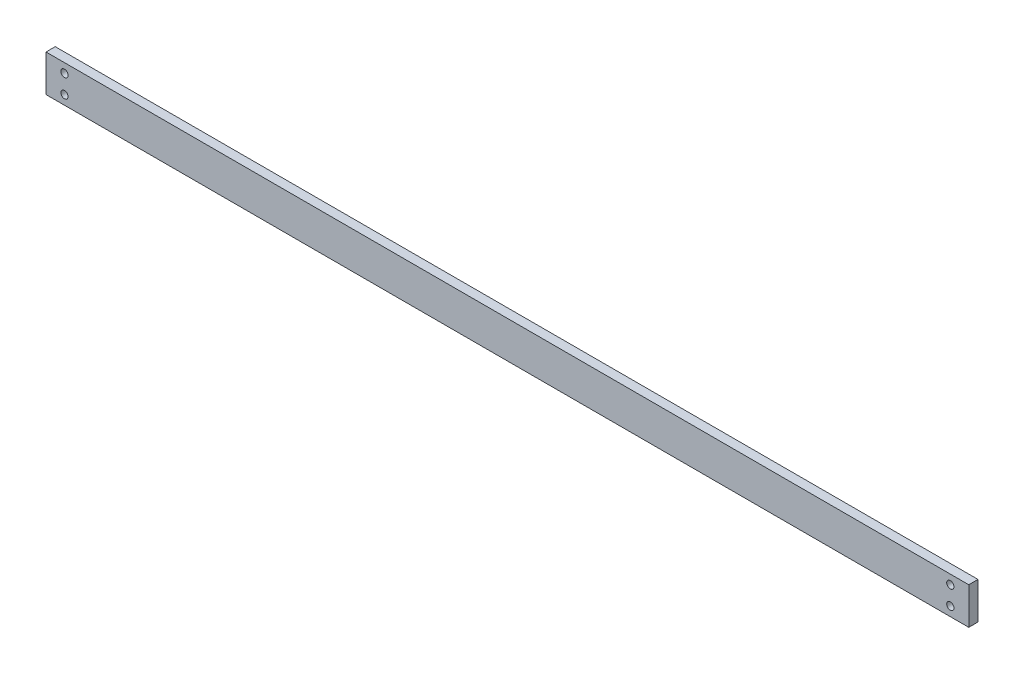
ISO-10303-21;
HEADER;
FILE_DESCRIPTION(('STEP AP214'),'2;1');
FILE_NAME('part.step','',(''),(''),'','','');
FILE_SCHEMA(('AUTOMOTIVE_DESIGN { 1 0 10303 214 1 1 1 1 }'));
ENDSEC;
DATA;
#1=APPLICATION_CONTEXT('core data for automotive mechanical design processes');
#2=APPLICATION_PROTOCOL_DEFINITION('international standard','automotive_design',2000,#1);
#3=PRODUCT_CONTEXT('',#1,'mechanical');
#4=PRODUCT('Part','Part','',(#3));
#5=PRODUCT_RELATED_PRODUCT_CATEGORY('part','',(#4));
#6=PRODUCT_DEFINITION_FORMATION('','',#4);
#7=PRODUCT_DEFINITION_CONTEXT('part definition',#1,'design');
#8=PRODUCT_DEFINITION('design','',#6,#7);
#9=PRODUCT_DEFINITION_SHAPE('','',#8);
#10=(LENGTH_UNIT() NAMED_UNIT(*) SI_UNIT(.MILLI.,.METRE.));
#11=(NAMED_UNIT(*) PLANE_ANGLE_UNIT() SI_UNIT($,.RADIAN.));
#12=(NAMED_UNIT(*) SI_UNIT($,.STERADIAN.) SOLID_ANGLE_UNIT());
#13=UNCERTAINTY_MEASURE_WITH_UNIT(LENGTH_MEASURE(1.E-05),#10,'distance_accuracy_value','');
#14=(GEOMETRIC_REPRESENTATION_CONTEXT(3) GLOBAL_UNCERTAINTY_ASSIGNED_CONTEXT((#13)) GLOBAL_UNIT_ASSIGNED_CONTEXT((#10,
#11,#12)) REPRESENTATION_CONTEXT('',''));
#15=CARTESIAN_POINT('',(0.,0.,0.));
#16=DIRECTION('',(0.,0.,1.));
#17=DIRECTION('',(1.,0.,0.));
#18=AXIS2_PLACEMENT_3D('',#15,#16,#17);
#19=CARTESIAN_POINT('',(317.5,-12.7,3.175));
#20=DIRECTION('',(-1.,0.,0.));
#21=DIRECTION('',(0.,0.,1.));
#22=AXIS2_PLACEMENT_3D('',#19,#20,#21);
#23=PLANE('',#22);
#24=DIRECTION('',(0.,1.,0.));
#25=VECTOR('',#24,1.);
#26=CARTESIAN_POINT('',(317.5,-12.7,-3.175));
#27=LINE('',#26,#25);
#28=CARTESIAN_POINT('',(317.5,-12.7,-3.175));
#29=VERTEX_POINT('',#28);
#30=CARTESIAN_POINT('',(317.5,12.7,-3.175));
#31=VERTEX_POINT('',#30);
#32=EDGE_CURVE('E113',#29,#31,#27,.T.);
#33=ORIENTED_EDGE('',*,*,#32,.T.);
#34=DIRECTION('',(0.,0.,-1.));
#35=VECTOR('',#34,1.);
#36=CARTESIAN_POINT('',(317.5,12.7,3.175));
#37=LINE('',#36,#35);
#38=CARTESIAN_POINT('',(317.5,12.7,3.175));
#39=VERTEX_POINT('',#38);
#40=EDGE_CURVE('E11',#39,#31,#37,.T.);
#41=ORIENTED_EDGE('',*,*,#40,.F.);
#42=DIRECTION('',(0.,1.,0.));
#43=VECTOR('',#42,1.);
#44=CARTESIAN_POINT('',(317.5,-12.7,3.175));
#45=LINE('',#44,#43);
#46=CARTESIAN_POINT('',(317.5,-12.7,3.175));
#47=VERTEX_POINT('',#46);
#48=EDGE_CURVE('E97',#47,#39,#45,.T.);
#49=ORIENTED_EDGE('',*,*,#48,.F.);
#50=DIRECTION('',(0.,0.,-1.));
#51=VECTOR('',#50,1.);
#52=CARTESIAN_POINT('',(317.5,-12.7,3.175));
#53=LINE('',#52,#51);
#54=EDGE_CURVE('E109',#47,#29,#53,.T.);
#55=ORIENTED_EDGE('',*,*,#54,.T.);
#56=EDGE_LOOP('',(#33,#41,#49,#55));
#57=FACE_BOUND('',#56,.T.);
#58=ADVANCED_FACE('F45',(#57),#23,.F.);
#59=CARTESIAN_POINT('',(-317.5,12.7,3.175));
#60=DIRECTION('',(0.,-1.,0.));
#61=DIRECTION('',(0.,0.,-1.));
#62=AXIS2_PLACEMENT_3D('',#59,#60,#61);
#63=PLANE('',#62);
#64=DIRECTION('',(-1.,0.,0.));
#65=VECTOR('',#64,1.);
#66=CARTESIAN_POINT('',(-317.5,12.7,-3.175));
#67=LINE('',#66,#65);
#68=CARTESIAN_POINT('',(-317.5,12.7,-3.175));
#69=VERTEX_POINT('',#68);
#70=EDGE_CURVE('E102',#31,#69,#67,.T.);
#71=ORIENTED_EDGE('',*,*,#70,.T.);
#72=DIRECTION('',(0.,0.,-1.));
#73=VECTOR('',#72,1.);
#74=CARTESIAN_POINT('',(-317.5,12.7,3.175));
#75=LINE('',#74,#73);
#76=CARTESIAN_POINT('',(-317.5,12.7,3.175));
#77=VERTEX_POINT('',#76);
#78=EDGE_CURVE('E54',#77,#69,#75,.T.);
#79=ORIENTED_EDGE('',*,*,#78,.F.);
#80=DIRECTION('',(-1.,0.,0.));
#81=VECTOR('',#80,1.);
#82=CARTESIAN_POINT('',(-317.5,12.7,3.175));
#83=LINE('',#82,#81);
#84=EDGE_CURVE('E92',#39,#77,#83,.T.);
#85=ORIENTED_EDGE('',*,*,#84,.F.);
#86=ORIENTED_EDGE('',*,*,#40,.T.);
#87=EDGE_LOOP('',(#71,#79,#85,#86));
#88=FACE_BOUND('',#87,.T.);
#89=ADVANCED_FACE('F101',(#88),#63,.F.);
#90=CARTESIAN_POINT('',(-317.5,-12.7,3.175));
#91=DIRECTION('',(1.,0.,0.));
#92=DIRECTION('',(0.,0.,-1.));
#93=AXIS2_PLACEMENT_3D('',#90,#91,#92);
#94=PLANE('',#93);
#95=DIRECTION('',(0.,-1.,0.));
#96=VECTOR('',#95,1.);
#97=CARTESIAN_POINT('',(-317.5,-12.7,-3.175));
#98=LINE('',#97,#96);
#99=CARTESIAN_POINT('',(-317.5,-12.7,-3.175));
#100=VERTEX_POINT('',#99);
#101=EDGE_CURVE('E79',#69,#100,#98,.T.);
#102=ORIENTED_EDGE('',*,*,#101,.T.);
#103=DIRECTION('',(0.,0.,-1.));
#104=VECTOR('',#103,1.);
#105=CARTESIAN_POINT('',(-317.5,-12.7,3.175));
#106=LINE('',#105,#104);
#107=CARTESIAN_POINT('',(-317.5,-12.7,3.175));
#108=VERTEX_POINT('',#107);
#109=EDGE_CURVE('E104',#108,#100,#106,.T.);
#110=ORIENTED_EDGE('',*,*,#109,.F.);
#111=DIRECTION('',(0.,-1.,0.));
#112=VECTOR('',#111,1.);
#113=CARTESIAN_POINT('',(-317.5,-12.7,3.175));
#114=LINE('',#113,#112);
#115=EDGE_CURVE('E95',#77,#108,#114,.T.);
#116=ORIENTED_EDGE('',*,*,#115,.F.);
#117=ORIENTED_EDGE('',*,*,#78,.T.);
#118=EDGE_LOOP('',(#102,#110,#116,#117));
#119=FACE_BOUND('',#118,.T.);
#120=ADVANCED_FACE('F105',(#119),#94,.F.);
#121=CARTESIAN_POINT('',(-317.5,-12.7,3.175));
#122=DIRECTION('',(0.,1.,0.));
#123=DIRECTION('',(0.,0.,1.));
#124=AXIS2_PLACEMENT_3D('',#121,#122,#123);
#125=PLANE('',#124);
#126=DIRECTION('',(1.,0.,0.));
#127=VECTOR('',#126,1.);
#128=CARTESIAN_POINT('',(-317.5,-12.7,-3.175));
#129=LINE('',#128,#127);
#130=EDGE_CURVE('E85',#100,#29,#129,.T.);
#131=ORIENTED_EDGE('',*,*,#130,.T.);
#132=ORIENTED_EDGE('',*,*,#54,.F.);
#133=DIRECTION('',(1.,0.,0.));
#134=VECTOR('',#133,1.);
#135=CARTESIAN_POINT('',(-317.5,-12.7,3.175));
#136=LINE('',#135,#134);
#137=EDGE_CURVE('E62',#108,#47,#136,.T.);
#138=ORIENTED_EDGE('',*,*,#137,.F.);
#139=ORIENTED_EDGE('',*,*,#109,.T.);
#140=EDGE_LOOP('',(#131,#132,#138,#139));
#141=FACE_BOUND('',#140,.T.);
#142=ADVANCED_FACE('F127',(#141),#125,.F.);
#143=CARTESIAN_POINT('',(0.,0.,3.175));
#144=DIRECTION('',(0.,0.,-1.));
#145=DIRECTION('',(-1.,0.,0.));
#146=AXIS2_PLACEMENT_3D('',#143,#144,#145);
#147=PLANE('',#146);
#148=CARTESIAN_POINT('',(-304.8,-6.34999999999996,3.175));
#149=DIRECTION('',(0.,0.,1.));
#150=DIRECTION('',(-1.,0.,0.));
#151=AXIS2_PLACEMENT_3D('',#148,#149,#150);
#152=CIRCLE('',#151,2.48920000000001);
#153=CARTESIAN_POINT('',(-307.2892,-6.34999999999996,3.175));
#154=VERTEX_POINT('',#153);
#155=EDGE_CURVE('E142',#154,#154,#152,.T.);
#156=ORIENTED_EDGE('',*,*,#155,.F.);
#157=EDGE_LOOP('',(#156));
#158=FACE_BOUND('',#157,.T.);
#159=CARTESIAN_POINT('',(-304.8,6.35000000000004,3.175));
#160=DIRECTION('',(0.,0.,1.));
#161=DIRECTION('',(-1.,0.,0.));
#162=AXIS2_PLACEMENT_3D('',#159,#160,#161);
#163=CIRCLE('',#162,2.48920000000001);
#164=CARTESIAN_POINT('',(-307.2892,6.35000000000004,3.175));
#165=VERTEX_POINT('',#164);
#166=EDGE_CURVE('E151',#165,#165,#163,.T.);
#167=ORIENTED_EDGE('',*,*,#166,.F.);
#168=EDGE_LOOP('',(#167));
#169=FACE_BOUND('',#168,.T.);
#170=CARTESIAN_POINT('',(304.8,6.35000000000011,3.175));
#171=DIRECTION('',(0.,0.,1.));
#172=DIRECTION('',(1.,0.,0.));
#173=AXIS2_PLACEMENT_3D('',#170,#171,#172);
#174=CIRCLE('',#173,2.48920000000001);
#175=CARTESIAN_POINT('',(307.2892,6.35000000000011,3.175));
#176=VERTEX_POINT('',#175);
#177=EDGE_CURVE('E141',#176,#176,#174,.T.);
#178=ORIENTED_EDGE('',*,*,#177,.F.);
#179=EDGE_LOOP('',(#178));
#180=FACE_BOUND('',#179,.T.);
#181=CARTESIAN_POINT('',(304.8,-6.34999999999989,3.175));
#182=DIRECTION('',(0.,0.,1.));
#183=DIRECTION('',(1.,0.,0.));
#184=AXIS2_PLACEMENT_3D('',#181,#182,#183);
#185=CIRCLE('',#184,2.48920000000001);
#186=CARTESIAN_POINT('',(307.2892,-6.34999999999989,3.175));
#187=VERTEX_POINT('',#186);
#188=EDGE_CURVE('E137',#187,#187,#185,.T.);
#189=ORIENTED_EDGE('',*,*,#188,.F.);
#190=EDGE_LOOP('',(#189));
#191=FACE_BOUND('',#190,.T.);
#192=ORIENTED_EDGE('',*,*,#48,.T.);
#193=ORIENTED_EDGE('',*,*,#84,.T.);
#194=ORIENTED_EDGE('',*,*,#115,.T.);
#195=ORIENTED_EDGE('',*,*,#137,.T.);
#196=EDGE_LOOP('',(#192,#193,#194,#195));
#197=FACE_BOUND('',#196,.T.);
#198=ADVANCED_FACE('F93',(#158,#169,#180,#191,#197),#147,.F.);
#199=CARTESIAN_POINT('',(0.,0.,-3.175));
#200=DIRECTION('',(0.,0.,-1.));
#201=DIRECTION('',(-1.,0.,0.));
#202=AXIS2_PLACEMENT_3D('',#199,#200,#201);
#203=PLANE('',#202);
#204=CARTESIAN_POINT('',(-304.8,-6.34999999999996,-3.175));
#205=DIRECTION('',(0.,0.,1.));
#206=DIRECTION('',(-1.,0.,0.));
#207=AXIS2_PLACEMENT_3D('',#204,#205,#206);
#208=CIRCLE('',#207,2.48920000000001);
#209=CARTESIAN_POINT('',(-307.2892,-6.34999999999996,-3.175));
#210=VERTEX_POINT('',#209);
#211=EDGE_CURVE('E147',#210,#210,#208,.T.);
#212=ORIENTED_EDGE('',*,*,#211,.T.);
#213=EDGE_LOOP('',(#212));
#214=FACE_BOUND('',#213,.T.);
#215=CARTESIAN_POINT('',(-304.8,6.35000000000004,-3.175));
#216=DIRECTION('',(0.,0.,1.));
#217=DIRECTION('',(-1.,0.,0.));
#218=AXIS2_PLACEMENT_3D('',#215,#216,#217);
#219=CIRCLE('',#218,2.48920000000001);
#220=CARTESIAN_POINT('',(-307.2892,6.35000000000004,-3.175));
#221=VERTEX_POINT('',#220);
#222=EDGE_CURVE('E146',#221,#221,#219,.T.);
#223=ORIENTED_EDGE('',*,*,#222,.T.);
#224=EDGE_LOOP('',(#223));
#225=FACE_BOUND('',#224,.T.);
#226=CARTESIAN_POINT('',(304.8,6.35000000000011,-3.175));
#227=DIRECTION('',(0.,0.,1.));
#228=DIRECTION('',(1.,0.,0.));
#229=AXIS2_PLACEMENT_3D('',#226,#227,#228);
#230=CIRCLE('',#229,2.48920000000001);
#231=CARTESIAN_POINT('',(307.2892,6.35000000000011,-3.175));
#232=VERTEX_POINT('',#231);
#233=EDGE_CURVE('E155',#232,#232,#230,.T.);
#234=ORIENTED_EDGE('',*,*,#233,.T.);
#235=EDGE_LOOP('',(#234));
#236=FACE_BOUND('',#235,.T.);
#237=CARTESIAN_POINT('',(304.8,-6.34999999999989,-3.175));
#238=DIRECTION('',(0.,0.,1.));
#239=DIRECTION('',(1.,0.,0.));
#240=AXIS2_PLACEMENT_3D('',#237,#238,#239);
#241=CIRCLE('',#240,2.48920000000001);
#242=CARTESIAN_POINT('',(307.2892,-6.34999999999989,-3.175));
#243=VERTEX_POINT('',#242);
#244=EDGE_CURVE('E117',#243,#243,#241,.T.);
#245=ORIENTED_EDGE('',*,*,#244,.T.);
#246=EDGE_LOOP('',(#245));
#247=FACE_BOUND('',#246,.T.);
#248=ORIENTED_EDGE('',*,*,#32,.F.);
#249=ORIENTED_EDGE('',*,*,#130,.F.);
#250=ORIENTED_EDGE('',*,*,#101,.F.);
#251=ORIENTED_EDGE('',*,*,#70,.F.);
#252=EDGE_LOOP('',(#248,#249,#250,#251));
#253=FACE_BOUND('',#252,.T.);
#254=ADVANCED_FACE('F130',(#214,#225,#236,#247,#253),#203,.T.);
#255=CARTESIAN_POINT('',(304.8,-6.34999999999989,-3.175));
#256=DIRECTION('',(0.,0.,1.));
#257=DIRECTION('',(1.,0.,0.));
#258=AXIS2_PLACEMENT_3D('',#255,#256,#257);
#259=CYLINDRICAL_SURFACE('',#258,2.48920000000001);
#260=ORIENTED_EDGE('',*,*,#244,.F.);
#261=EDGE_LOOP('',(#260));
#262=FACE_BOUND('',#261,.T.);
#263=ORIENTED_EDGE('',*,*,#188,.T.);
#264=EDGE_LOOP('',(#263));
#265=FACE_BOUND('',#264,.T.);
#266=ADVANCED_FACE('F172',(#262,#265),#259,.F.);
#267=CARTESIAN_POINT('',(304.8,6.35000000000011,-3.175));
#268=DIRECTION('',(0.,0.,1.));
#269=DIRECTION('',(1.,0.,0.));
#270=AXIS2_PLACEMENT_3D('',#267,#268,#269);
#271=CYLINDRICAL_SURFACE('',#270,2.48920000000001);
#272=ORIENTED_EDGE('',*,*,#233,.F.);
#273=EDGE_LOOP('',(#272));
#274=FACE_BOUND('',#273,.T.);
#275=ORIENTED_EDGE('',*,*,#177,.T.);
#276=EDGE_LOOP('',(#275));
#277=FACE_BOUND('',#276,.T.);
#278=ADVANCED_FACE('F168',(#274,#277),#271,.F.);
#279=CARTESIAN_POINT('',(-304.8,6.35000000000004,-3.175));
#280=DIRECTION('',(0.,0.,1.));
#281=DIRECTION('',(1.,0.,0.));
#282=AXIS2_PLACEMENT_3D('',#279,#280,#281);
#283=CYLINDRICAL_SURFACE('',#282,2.48920000000001);
#284=ORIENTED_EDGE('',*,*,#222,.F.);
#285=EDGE_LOOP('',(#284));
#286=FACE_BOUND('',#285,.T.);
#287=ORIENTED_EDGE('',*,*,#166,.T.);
#288=EDGE_LOOP('',(#287));
#289=FACE_BOUND('',#288,.T.);
#290=ADVANCED_FACE('F171',(#286,#289),#283,.F.);
#291=CARTESIAN_POINT('',(-304.8,-6.34999999999996,-3.175));
#292=DIRECTION('',(0.,0.,1.));
#293=DIRECTION('',(1.,0.,0.));
#294=AXIS2_PLACEMENT_3D('',#291,#292,#293);
#295=CYLINDRICAL_SURFACE('',#294,2.48920000000001);
#296=ORIENTED_EDGE('',*,*,#211,.F.);
#297=EDGE_LOOP('',(#296));
#298=FACE_BOUND('',#297,.T.);
#299=ORIENTED_EDGE('',*,*,#155,.T.);
#300=EDGE_LOOP('',(#299));
#301=FACE_BOUND('',#300,.T.);
#302=ADVANCED_FACE('F236',(#298,#301),#295,.F.);
#303=CLOSED_SHELL('',(#58,#89,#120,#142,#198,#254,#266,#278,#290,#302));
#304=MANIFOLD_SOLID_BREP('B2',#303);
#305=ADVANCED_BREP_SHAPE_REPRESENTATION('',(#18,#304),#14);
#306=SHAPE_DEFINITION_REPRESENTATION(#9,#305);
ENDSEC;
END-ISO-10303-21;
